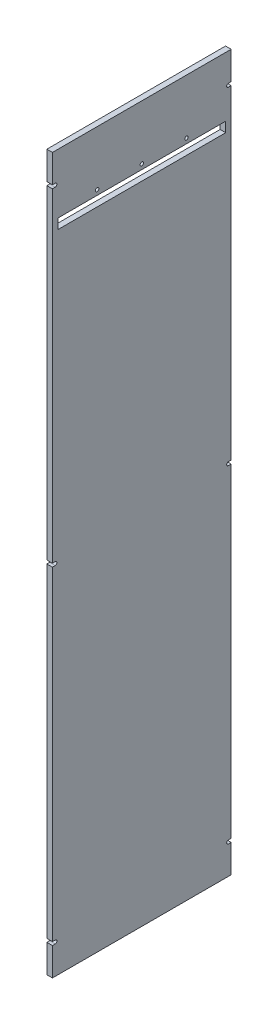
ISO-10303-21;
HEADER;
FILE_DESCRIPTION(('STEP AP214'),'2;1');
FILE_NAME('part.step','',(''),(''),'','','');
FILE_SCHEMA(('AUTOMOTIVE_DESIGN { 1 0 10303 214 1 1 1 1 }'));
ENDSEC;
DATA;
#1=APPLICATION_CONTEXT('core data for automotive mechanical design processes');
#2=APPLICATION_PROTOCOL_DEFINITION('international standard','automotive_design',2000,#1);
#3=PRODUCT_CONTEXT('',#1,'mechanical');
#4=PRODUCT('Part','Part','',(#3));
#5=PRODUCT_RELATED_PRODUCT_CATEGORY('part','',(#4));
#6=PRODUCT_DEFINITION_FORMATION('','',#4);
#7=PRODUCT_DEFINITION_CONTEXT('part definition',#1,'design');
#8=PRODUCT_DEFINITION('design','',#6,#7);
#9=PRODUCT_DEFINITION_SHAPE('','',#8);
#10=(LENGTH_UNIT() NAMED_UNIT(*) SI_UNIT(.MILLI.,.METRE.));
#11=(NAMED_UNIT(*) PLANE_ANGLE_UNIT() SI_UNIT($,.RADIAN.));
#12=(NAMED_UNIT(*) SI_UNIT($,.STERADIAN.) SOLID_ANGLE_UNIT());
#13=UNCERTAINTY_MEASURE_WITH_UNIT(LENGTH_MEASURE(1.E-05),#10,'distance_accuracy_value','');
#14=(GEOMETRIC_REPRESENTATION_CONTEXT(3) GLOBAL_UNCERTAINTY_ASSIGNED_CONTEXT((#13)) GLOBAL_UNIT_ASSIGNED_CONTEXT((#10,
#11,#12)) REPRESENTATION_CONTEXT('',''));
#15=CARTESIAN_POINT('',(0.,0.,0.));
#16=DIRECTION('',(0.,0.,1.));
#17=DIRECTION('',(1.,0.,0.));
#18=AXIS2_PLACEMENT_3D('',#15,#16,#17);
#19=CARTESIAN_POINT('',(0.,609.6,0.));
#20=DIRECTION('',(0.,0.,-1.));
#21=DIRECTION('',(-1.,0.,0.));
#22=AXIS2_PLACEMENT_3D('',#19,#20,#21);
#23=PLANE('',#22);
#24=DIRECTION('',(0.,-1.,0.));
#25=VECTOR('',#24,1.);
#26=CARTESIAN_POINT('',(4.7625,609.6,0.));
#27=LINE('',#26,#25);
#28=CARTESIAN_POINT('',(4.7625,582.7395,0.));
#29=VERTEX_POINT('',#28);
#30=CARTESIAN_POINT('',(4.7625,306.2605,0.));
#31=VERTEX_POINT('',#30);
#32=EDGE_CURVE('E492',#29,#31,#27,.T.);
#33=ORIENTED_EDGE('',*,*,#32,.F.);
#34=DIRECTION('',(1.,0.,0.));
#35=VECTOR('',#34,1.);
#36=CARTESIAN_POINT('',(0.,582.7395,0.));
#37=LINE('',#36,#35);
#38=CARTESIAN_POINT('',(0.,582.7395,0.));
#39=VERTEX_POINT('',#38);
#40=EDGE_CURVE('E302',#39,#29,#37,.T.);
#41=ORIENTED_EDGE('',*,*,#40,.F.);
#42=DIRECTION('',(0.,-1.,0.));
#43=VECTOR('',#42,1.);
#44=CARTESIAN_POINT('',(0.,609.6,0.));
#45=LINE('',#44,#43);
#46=CARTESIAN_POINT('',(0.,306.2605,0.));
#47=VERTEX_POINT('',#46);
#48=EDGE_CURVE('E43',#39,#47,#45,.T.);
#49=ORIENTED_EDGE('',*,*,#48,.T.);
#50=DIRECTION('',(1.,0.,0.));
#51=VECTOR('',#50,1.);
#52=CARTESIAN_POINT('',(0.,306.2605,0.));
#53=LINE('',#52,#51);
#54=EDGE_CURVE('E380',#47,#31,#53,.T.);
#55=ORIENTED_EDGE('',*,*,#54,.T.);
#56=EDGE_LOOP('',(#33,#41,#49,#55));
#57=FACE_BOUND('',#56,.T.);
#58=ADVANCED_FACE('F35',(#57),#23,.F.);
#59=CARTESIAN_POINT('',(4.7625,303.3395,0.));
#60=VERTEX_POINT('',#59);
#61=CARTESIAN_POINT('',(4.7625,26.8605000000001,0.));
#62=VERTEX_POINT('',#61);
#63=EDGE_CURVE('E493',#60,#62,#27,.T.);
#64=ORIENTED_EDGE('',*,*,#63,.F.);
#65=DIRECTION('',(1.,0.,0.));
#66=VECTOR('',#65,1.);
#67=CARTESIAN_POINT('',(0.,303.3395,0.));
#68=LINE('',#67,#66);
#69=CARTESIAN_POINT('',(0.,303.3395,0.));
#70=VERTEX_POINT('',#69);
#71=EDGE_CURVE('E378',#70,#60,#68,.T.);
#72=ORIENTED_EDGE('',*,*,#71,.F.);
#73=CARTESIAN_POINT('',(0.,26.8605000000001,0.));
#74=VERTEX_POINT('',#73);
#75=EDGE_CURVE('E44',#70,#74,#45,.T.);
#76=ORIENTED_EDGE('',*,*,#75,.T.);
#77=DIRECTION('',(1.,0.,0.));
#78=VECTOR('',#77,1.);
#79=CARTESIAN_POINT('',(0.,26.8605000000001,0.));
#80=LINE('',#79,#78);
#81=EDGE_CURVE('E406',#74,#62,#80,.T.);
#82=ORIENTED_EDGE('',*,*,#81,.T.);
#83=EDGE_LOOP('',(#64,#72,#76,#82));
#84=FACE_BOUND('',#83,.T.);
#85=ADVANCED_FACE('F545',(#84),#23,.F.);
#86=CARTESIAN_POINT('',(0.,609.6,-152.4));
#87=DIRECTION('',(0.,0.,1.));
#88=DIRECTION('',(1.,0.,0.));
#89=AXIS2_PLACEMENT_3D('',#86,#87,#88);
#90=PLANE('',#89);
#91=DIRECTION('',(0.,-1.,0.));
#92=VECTOR('',#91,1.);
#93=CARTESIAN_POINT('',(4.7625,609.6,-152.4));
#94=LINE('',#93,#92);
#95=CARTESIAN_POINT('',(4.7625,609.6,-152.4));
#96=VERTEX_POINT('',#95);
#97=CARTESIAN_POINT('',(4.7625,585.6605,-152.4));
#98=VERTEX_POINT('',#97);
#99=EDGE_CURVE('E486',#96,#98,#94,.T.);
#100=ORIENTED_EDGE('',*,*,#99,.T.);
#101=DIRECTION('',(1.,0.,0.));
#102=VECTOR('',#101,1.);
#103=CARTESIAN_POINT('',(0.,585.6605,-152.4));
#104=LINE('',#103,#102);
#105=CARTESIAN_POINT('',(0.,585.6605,-152.4));
#106=VERTEX_POINT('',#105);
#107=EDGE_CURVE('E327',#106,#98,#104,.T.);
#108=ORIENTED_EDGE('',*,*,#107,.F.);
#109=DIRECTION('',(0.,-1.,0.));
#110=VECTOR('',#109,1.);
#111=CARTESIAN_POINT('',(0.,609.6,-152.4));
#112=LINE('',#111,#110);
#113=CARTESIAN_POINT('',(0.,609.6,-152.4));
#114=VERTEX_POINT('',#113);
#115=EDGE_CURVE('E482',#114,#106,#112,.T.);
#116=ORIENTED_EDGE('',*,*,#115,.F.);
#117=DIRECTION('',(-1.,0.,0.));
#118=VECTOR('',#117,1.);
#119=CARTESIAN_POINT('',(0.,609.6,-152.4));
#120=LINE('',#119,#118);
#121=EDGE_CURVE('E469',#96,#114,#120,.T.);
#122=ORIENTED_EDGE('',*,*,#121,.F.);
#123=EDGE_LOOP('',(#100,#108,#116,#122));
#124=FACE_BOUND('',#123,.T.);
#125=ADVANCED_FACE('F551',(#124),#90,.F.);
#126=CARTESIAN_POINT('',(0.,582.7395,-152.4));
#127=VERTEX_POINT('',#126);
#128=CARTESIAN_POINT('',(0.,306.2605,-152.4));
#129=VERTEX_POINT('',#128);
#130=EDGE_CURVE('E485',#127,#129,#112,.T.);
#131=ORIENTED_EDGE('',*,*,#130,.F.);
#132=DIRECTION('',(1.,0.,0.));
#133=VECTOR('',#132,1.);
#134=CARTESIAN_POINT('',(0.,582.7395,-152.4));
#135=LINE('',#134,#133);
#136=CARTESIAN_POINT('',(4.7625,582.7395,-152.4));
#137=VERTEX_POINT('',#136);
#138=EDGE_CURVE('E329',#127,#137,#135,.T.);
#139=ORIENTED_EDGE('',*,*,#138,.T.);
#140=CARTESIAN_POINT('',(4.7625,306.2605,-152.4));
#141=VERTEX_POINT('',#140);
#142=EDGE_CURVE('E489',#137,#141,#94,.T.);
#143=ORIENTED_EDGE('',*,*,#142,.T.);
#144=DIRECTION('',(1.,0.,0.));
#145=VECTOR('',#144,1.);
#146=CARTESIAN_POINT('',(0.,306.2605,-152.4));
#147=LINE('',#146,#145);
#148=EDGE_CURVE('E281',#129,#141,#147,.T.);
#149=ORIENTED_EDGE('',*,*,#148,.F.);
#150=EDGE_LOOP('',(#131,#139,#143,#149));
#151=FACE_BOUND('',#150,.T.);
#152=ADVANCED_FACE('F529',(#151),#90,.F.);
#153=CARTESIAN_POINT('',(0.,303.3395,-152.4));
#154=VERTEX_POINT('',#153);
#155=CARTESIAN_POINT('',(0.,26.8605000000001,-152.4));
#156=VERTEX_POINT('',#155);
#157=EDGE_CURVE('E626',#154,#156,#112,.T.);
#158=ORIENTED_EDGE('',*,*,#157,.F.);
#159=DIRECTION('',(1.,0.,0.));
#160=VECTOR('',#159,1.);
#161=CARTESIAN_POINT('',(0.,303.3395,-152.4));
#162=LINE('',#161,#160);
#163=CARTESIAN_POINT('',(4.7625,303.3395,-152.4));
#164=VERTEX_POINT('',#163);
#165=EDGE_CURVE('E256',#154,#164,#162,.T.);
#166=ORIENTED_EDGE('',*,*,#165,.T.);
#167=CARTESIAN_POINT('',(4.7625,26.8605000000001,-152.4));
#168=VERTEX_POINT('',#167);
#169=EDGE_CURVE('E519',#164,#168,#94,.T.);
#170=ORIENTED_EDGE('',*,*,#169,.T.);
#171=DIRECTION('',(1.,0.,0.));
#172=VECTOR('',#171,1.);
#173=CARTESIAN_POINT('',(0.,26.8605000000001,-152.4));
#174=LINE('',#173,#172);
#175=EDGE_CURVE('E355',#156,#168,#174,.T.);
#176=ORIENTED_EDGE('',*,*,#175,.F.);
#177=EDGE_LOOP('',(#158,#166,#170,#176));
#178=FACE_BOUND('',#177,.T.);
#179=ADVANCED_FACE('F564',(#178),#90,.F.);
#180=CARTESIAN_POINT('',(4.7625,23.9395000000001,0.));
#181=VERTEX_POINT('',#180);
#182=CARTESIAN_POINT('',(4.7625,0.,0.));
#183=VERTEX_POINT('',#182);
#184=EDGE_CURVE('E488',#181,#183,#27,.T.);
#185=ORIENTED_EDGE('',*,*,#184,.F.);
#186=DIRECTION('',(1.,0.,0.));
#187=VECTOR('',#186,1.);
#188=CARTESIAN_POINT('',(0.,23.9395000000001,0.));
#189=LINE('',#188,#187);
#190=CARTESIAN_POINT('',(0.,23.9395000000001,0.));
#191=VERTEX_POINT('',#190);
#192=EDGE_CURVE('E404',#191,#181,#189,.T.);
#193=ORIENTED_EDGE('',*,*,#192,.F.);
#194=CARTESIAN_POINT('',(0.,0.,0.));
#195=VERTEX_POINT('',#194);
#196=EDGE_CURVE('E45',#191,#195,#45,.T.);
#197=ORIENTED_EDGE('',*,*,#196,.T.);
#198=DIRECTION('',(1.,0.,0.));
#199=VECTOR('',#198,1.);
#200=CARTESIAN_POINT('',(0.,0.,0.));
#201=LINE('',#200,#199);
#202=EDGE_CURVE('E474',#195,#183,#201,.T.);
#203=ORIENTED_EDGE('',*,*,#202,.T.);
#204=EDGE_LOOP('',(#185,#193,#197,#203));
#205=FACE_BOUND('',#204,.T.);
#206=ADVANCED_FACE('F510',(#205),#23,.F.);
#207=CARTESIAN_POINT('',(0.,609.6,0.));
#208=DIRECTION('',(1.,0.,0.));
#209=DIRECTION('',(0.,0.,-1.));
#210=AXIS2_PLACEMENT_3D('',#207,#208,#209);
#211=PLANE('',#210);
#212=CARTESIAN_POINT('',(0.,563.0545,-76.2));
#213=DIRECTION('',(1.,0.,0.));
#214=DIRECTION('',(0.,0.,-1.));
#215=AXIS2_PLACEMENT_3D('',#212,#213,#214);
#216=CIRCLE('',#215,1.47319999999995);
#217=CARTESIAN_POINT('',(0.,563.0545,-77.6732));
#218=VERTEX_POINT('',#217);
#219=EDGE_CURVE('E413',#218,#218,#216,.T.);
#220=ORIENTED_EDGE('',*,*,#219,.T.);
#221=EDGE_LOOP('',(#220));
#222=FACE_BOUND('',#221,.T.);
#223=CARTESIAN_POINT('',(0.,563.0545,-38.1));
#224=DIRECTION('',(1.,0.,0.));
#225=DIRECTION('',(0.,0.,-1.));
#226=AXIS2_PLACEMENT_3D('',#223,#224,#225);
#227=CIRCLE('',#226,1.47319999999995);
#228=CARTESIAN_POINT('',(0.,563.0545,-39.5732));
#229=VERTEX_POINT('',#228);
#230=EDGE_CURVE('E419',#229,#229,#227,.T.);
#231=ORIENTED_EDGE('',*,*,#230,.T.);
#232=EDGE_LOOP('',(#231));
#233=FACE_BOUND('',#232,.T.);
#234=CARTESIAN_POINT('',(0.,563.0545,-114.3));
#235=DIRECTION('',(1.,0.,0.));
#236=DIRECTION('',(0.,0.,-1.));
#237=AXIS2_PLACEMENT_3D('',#234,#235,#236);
#238=CIRCLE('',#237,1.47319999999995);
#239=CARTESIAN_POINT('',(0.,563.0545,-115.7732));
#240=VERTEX_POINT('',#239);
#241=EDGE_CURVE('E425',#240,#240,#238,.T.);
#242=ORIENTED_EDGE('',*,*,#241,.T.);
#243=EDGE_LOOP('',(#242));
#244=FACE_BOUND('',#243,.T.);
#245=DIRECTION('',(0.,0.,-1.));
#246=VECTOR('',#245,1.);
#247=CARTESIAN_POINT('',(0.,550.291,-147.7645));
#248=LINE('',#247,#246);
#249=CARTESIAN_POINT('',(0.,550.291,-4.63550000000007));
#250=VERTEX_POINT('',#249);
#251=CARTESIAN_POINT('',(0.,550.291,-147.7645));
#252=VERTEX_POINT('',#251);
#253=EDGE_CURVE('E439',#250,#252,#248,.T.);
#254=ORIENTED_EDGE('',*,*,#253,.T.);
#255=DIRECTION('',(0.,1.,0.));
#256=VECTOR('',#255,1.);
#257=CARTESIAN_POINT('',(0.,550.291,-147.7645));
#258=LINE('',#257,#256);
#259=CARTESIAN_POINT('',(0.,558.8,-147.7645));
#260=VERTEX_POINT('',#259);
#261=EDGE_CURVE('E429',#252,#260,#258,.T.);
#262=ORIENTED_EDGE('',*,*,#261,.T.);
#263=DIRECTION('',(0.,0.,1.));
#264=VECTOR('',#263,1.);
#265=CARTESIAN_POINT('',(0.,558.8,-147.7645));
#266=LINE('',#265,#264);
#267=CARTESIAN_POINT('',(0.,558.8,-4.63550000000007));
#268=VERTEX_POINT('',#267);
#269=EDGE_CURVE('E432',#260,#268,#266,.T.);
#270=ORIENTED_EDGE('',*,*,#269,.T.);
#271=DIRECTION('',(0.,-1.,0.));
#272=VECTOR('',#271,1.);
#273=CARTESIAN_POINT('',(0.,550.291,-4.63550000000007));
#274=LINE('',#273,#272);
#275=EDGE_CURVE('E436',#268,#250,#274,.T.);
#276=ORIENTED_EDGE('',*,*,#275,.T.);
#277=EDGE_LOOP('',(#254,#262,#270,#276));
#278=FACE_BOUND('',#277,.T.);
#279=ORIENTED_EDGE('',*,*,#115,.T.);
#280=DIRECTION('',(0.,0.,1.));
#281=VECTOR('',#280,1.);
#282=CARTESIAN_POINT('',(0.,585.6605,-150.01875));
#283=LINE('',#282,#281);
#284=CARTESIAN_POINT('',(0.,585.6605,-150.01875));
#285=VERTEX_POINT('',#284);
#286=EDGE_CURVE('E315',#106,#285,#283,.T.);
#287=ORIENTED_EDGE('',*,*,#286,.T.);
#288=CARTESIAN_POINT('',(0.,584.2,-150.01875));
#289=DIRECTION('',(1.,0.,0.));
#290=DIRECTION('',(0.,0.,-1.));
#291=AXIS2_PLACEMENT_3D('',#288,#289,#290);
#292=CIRCLE('',#291,1.46049999999998);
#293=CARTESIAN_POINT('',(0.,582.7395,-150.01875));
#294=VERTEX_POINT('',#293);
#295=EDGE_CURVE('E308',#285,#294,#292,.T.);
#296=ORIENTED_EDGE('',*,*,#295,.T.);
#297=DIRECTION('',(0.,0.,-1.));
#298=VECTOR('',#297,1.);
#299=CARTESIAN_POINT('',(0.,582.7395,-150.01875));
#300=LINE('',#299,#298);
#301=EDGE_CURVE('E311',#294,#127,#300,.T.);
#302=ORIENTED_EDGE('',*,*,#301,.T.);
#303=ORIENTED_EDGE('',*,*,#130,.T.);
#304=DIRECTION('',(0.,0.,1.));
#305=VECTOR('',#304,1.);
#306=CARTESIAN_POINT('',(0.,306.2605,-150.01875));
#307=LINE('',#306,#305);
#308=CARTESIAN_POINT('',(0.,306.2605,-150.01875));
#309=VERTEX_POINT('',#308);
#310=EDGE_CURVE('E257',#129,#309,#307,.T.);
#311=ORIENTED_EDGE('',*,*,#310,.T.);
#312=CARTESIAN_POINT('',(0.,304.8,-150.01875));
#313=DIRECTION('',(1.,0.,0.));
#314=DIRECTION('',(0.,0.,-1.));
#315=AXIS2_PLACEMENT_3D('',#312,#313,#314);
#316=CIRCLE('',#315,1.4605);
#317=CARTESIAN_POINT('',(0.,303.3395,-150.01875));
#318=VERTEX_POINT('',#317);
#319=EDGE_CURVE('E250',#309,#318,#316,.T.);
#320=ORIENTED_EDGE('',*,*,#319,.T.);
#321=DIRECTION('',(0.,0.,-1.));
#322=VECTOR('',#321,1.);
#323=CARTESIAN_POINT('',(0.,303.3395,-150.01875));
#324=LINE('',#323,#322);
#325=EDGE_CURVE('E260',#318,#154,#324,.T.);
#326=ORIENTED_EDGE('',*,*,#325,.T.);
#327=ORIENTED_EDGE('',*,*,#157,.T.);
#328=DIRECTION('',(0.,0.,1.));
#329=VECTOR('',#328,1.);
#330=CARTESIAN_POINT('',(0.,26.8605,-150.01875));
#331=LINE('',#330,#329);
#332=CARTESIAN_POINT('',(0.,26.8605,-150.01875));
#333=VERTEX_POINT('',#332);
#334=EDGE_CURVE('E340',#156,#333,#331,.T.);
#335=ORIENTED_EDGE('',*,*,#334,.T.);
#336=CARTESIAN_POINT('',(0.,25.4,-150.01875));
#337=DIRECTION('',(1.,0.,0.));
#338=DIRECTION('',(0.,0.,-1.));
#339=AXIS2_PLACEMENT_3D('',#336,#337,#338);
#340=CIRCLE('',#339,1.4605);
#341=CARTESIAN_POINT('',(0.,23.9395,-150.01875));
#342=VERTEX_POINT('',#341);
#343=EDGE_CURVE('E333',#333,#342,#340,.T.);
#344=ORIENTED_EDGE('',*,*,#343,.T.);
#345=DIRECTION('',(0.,0.,-1.));
#346=VECTOR('',#345,1.);
#347=CARTESIAN_POINT('',(0.,23.9395,-150.01875));
#348=LINE('',#347,#346);
#349=CARTESIAN_POINT('',(0.,23.9395000000001,-152.4));
#350=VERTEX_POINT('',#349);
#351=EDGE_CURVE('E336',#342,#350,#348,.T.);
#352=ORIENTED_EDGE('',*,*,#351,.T.);
#353=CARTESIAN_POINT('',(0.,0.,-152.4));
#354=VERTEX_POINT('',#353);
#355=EDGE_CURVE('E471',#350,#354,#112,.T.);
#356=ORIENTED_EDGE('',*,*,#355,.T.);
#357=DIRECTION('',(0.,0.,1.));
#358=VECTOR('',#357,1.);
#359=CARTESIAN_POINT('',(0.,0.,0.));
#360=LINE('',#359,#358);
#361=EDGE_CURVE('E454',#354,#195,#360,.T.);
#362=ORIENTED_EDGE('',*,*,#361,.T.);
#363=ORIENTED_EDGE('',*,*,#196,.F.);
#364=DIRECTION('',(0.,0.,-1.));
#365=VECTOR('',#364,1.);
#366=CARTESIAN_POINT('',(0.,23.9395,-2.38124999999999));
#367=LINE('',#366,#365);
#368=CARTESIAN_POINT('',(0.,23.9395,-2.38124999999999));
#369=VERTEX_POINT('',#368);
#370=EDGE_CURVE('E391',#191,#369,#367,.T.);
#371=ORIENTED_EDGE('',*,*,#370,.T.);
#372=CARTESIAN_POINT('',(0.,25.4,-2.38124999999999));
#373=DIRECTION('',(1.,0.,0.));
#374=DIRECTION('',(0.,0.,-1.));
#375=AXIS2_PLACEMENT_3D('',#372,#373,#374);
#376=CIRCLE('',#375,1.4605);
#377=CARTESIAN_POINT('',(0.,26.8605,-2.38124999999999));
#378=VERTEX_POINT('',#377);
#379=EDGE_CURVE('E384',#369,#378,#376,.T.);
#380=ORIENTED_EDGE('',*,*,#379,.T.);
#381=DIRECTION('',(0.,0.,1.));
#382=VECTOR('',#381,1.);
#383=CARTESIAN_POINT('',(0.,26.8605,-2.38124999999999));
#384=LINE('',#383,#382);
#385=EDGE_CURVE('E387',#378,#74,#384,.T.);
#386=ORIENTED_EDGE('',*,*,#385,.T.);
#387=ORIENTED_EDGE('',*,*,#75,.F.);
#388=DIRECTION('',(0.,0.,-1.));
#389=VECTOR('',#388,1.);
#390=CARTESIAN_POINT('',(0.,303.3395,-2.38124999999999));
#391=LINE('',#390,#389);
#392=CARTESIAN_POINT('',(0.,303.3395,-2.38124999999999));
#393=VERTEX_POINT('',#392);
#394=EDGE_CURVE('E368',#70,#393,#391,.T.);
#395=ORIENTED_EDGE('',*,*,#394,.T.);
#396=CARTESIAN_POINT('',(0.,304.8,-2.38124999999999));
#397=DIRECTION('',(1.,0.,0.));
#398=DIRECTION('',(0.,0.,-1.));
#399=AXIS2_PLACEMENT_3D('',#396,#397,#398);
#400=CIRCLE('',#399,1.4605);
#401=CARTESIAN_POINT('',(0.,306.2605,-2.38124999999999));
#402=VERTEX_POINT('',#401);
#403=EDGE_CURVE('E361',#393,#402,#400,.T.);
#404=ORIENTED_EDGE('',*,*,#403,.T.);
#405=DIRECTION('',(0.,0.,1.));
#406=VECTOR('',#405,1.);
#407=CARTESIAN_POINT('',(0.,306.2605,-2.38124999999999));
#408=LINE('',#407,#406);
#409=EDGE_CURVE('E364',#402,#47,#408,.T.);
#410=ORIENTED_EDGE('',*,*,#409,.T.);
#411=ORIENTED_EDGE('',*,*,#48,.F.);
#412=DIRECTION('',(0.,0.,-1.));
#413=VECTOR('',#412,1.);
#414=CARTESIAN_POINT('',(0.,582.7395,-2.38124999999999));
#415=LINE('',#414,#413);
#416=CARTESIAN_POINT('',(0.,582.7395,-2.38124999999999));
#417=VERTEX_POINT('',#416);
#418=EDGE_CURVE('E291',#39,#417,#415,.T.);
#419=ORIENTED_EDGE('',*,*,#418,.T.);
#420=CARTESIAN_POINT('',(0.,584.2,-2.38124999999999));
#421=DIRECTION('',(1.,0.,0.));
#422=DIRECTION('',(0.,0.,-1.));
#423=AXIS2_PLACEMENT_3D('',#420,#421,#422);
#424=CIRCLE('',#423,1.46049999999998);
#425=CARTESIAN_POINT('',(0.,585.6605,-2.38124999999999));
#426=VERTEX_POINT('',#425);
#427=EDGE_CURVE('E284',#417,#426,#424,.T.);
#428=ORIENTED_EDGE('',*,*,#427,.T.);
#429=DIRECTION('',(0.,0.,1.));
#430=VECTOR('',#429,1.);
#431=CARTESIAN_POINT('',(0.,585.6605,-2.38124999999999));
#432=LINE('',#431,#430);
#433=CARTESIAN_POINT('',(0.,585.6605,0.));
#434=VERTEX_POINT('',#433);
#435=EDGE_CURVE('E287',#426,#434,#432,.T.);
#436=ORIENTED_EDGE('',*,*,#435,.T.);
#437=CARTESIAN_POINT('',(0.,609.6,0.));
#438=VERTEX_POINT('',#437);
#439=EDGE_CURVE('E11',#438,#434,#45,.T.);
#440=ORIENTED_EDGE('',*,*,#439,.F.);
#441=DIRECTION('',(0.,0.,1.));
#442=VECTOR('',#441,1.);
#443=CARTESIAN_POINT('',(0.,609.6,0.));
#444=LINE('',#443,#442);
#445=EDGE_CURVE('E461',#114,#438,#444,.T.);
#446=ORIENTED_EDGE('',*,*,#445,.F.);
#447=EDGE_LOOP('',(#279,#287,#296,#302,#303,#311,#320,#326,#327,#335,#344,#352,#356,#362,#363,
#371,#380,#386,#387,#395,#404,#410,#411,#419,#428,#436,#440,#446));
#448=FACE_BOUND('',#447,.T.);
#449=ADVANCED_FACE('F37',(#222,#233,#244,#278,#448),#211,.F.);
#450=ORIENTED_EDGE('',*,*,#439,.T.);
#451=DIRECTION('',(1.,0.,0.));
#452=VECTOR('',#451,1.);
#453=CARTESIAN_POINT('',(0.,585.6605,0.));
#454=LINE('',#453,#452);
#455=CARTESIAN_POINT('',(4.7625,585.6605,0.));
#456=VERTEX_POINT('',#455);
#457=EDGE_CURVE('E304',#434,#456,#454,.T.);
#458=ORIENTED_EDGE('',*,*,#457,.T.);
#459=CARTESIAN_POINT('',(4.7625,609.6,0.));
#460=VERTEX_POINT('',#459);
#461=EDGE_CURVE('E490',#460,#456,#27,.T.);
#462=ORIENTED_EDGE('',*,*,#461,.F.);
#463=DIRECTION('',(1.,0.,0.));
#464=VECTOR('',#463,1.);
#465=CARTESIAN_POINT('',(0.,609.6,0.));
#466=LINE('',#465,#464);
#467=EDGE_CURVE('E464',#438,#460,#466,.T.);
#468=ORIENTED_EDGE('',*,*,#467,.F.);
#469=EDGE_LOOP('',(#450,#458,#462,#468));
#470=FACE_BOUND('',#469,.T.);
#471=ADVANCED_FACE('F547',(#470),#23,.F.);
#472=CARTESIAN_POINT('',(4.7625,609.6,0.));
#473=DIRECTION('',(-1.,0.,0.));
#474=DIRECTION('',(0.,0.,1.));
#475=AXIS2_PLACEMENT_3D('',#472,#473,#474);
#476=PLANE('',#475);
#477=CARTESIAN_POINT('',(4.7625,563.0545,-76.2));
#478=DIRECTION('',(1.,0.,0.));
#479=DIRECTION('',(0.,0.,-1.));
#480=AXIS2_PLACEMENT_3D('',#477,#478,#479);
#481=CIRCLE('',#480,1.47319999999995);
#482=CARTESIAN_POINT('',(4.7625,563.0545,-77.6732));
#483=VERTEX_POINT('',#482);
#484=EDGE_CURVE('E403',#483,#483,#481,.T.);
#485=ORIENTED_EDGE('',*,*,#484,.F.);
#486=EDGE_LOOP('',(#485));
#487=FACE_BOUND('',#486,.T.);
#488=CARTESIAN_POINT('',(4.7625,563.0545,-38.1));
#489=DIRECTION('',(1.,0.,0.));
#490=DIRECTION('',(0.,0.,-1.));
#491=AXIS2_PLACEMENT_3D('',#488,#489,#490);
#492=CIRCLE('',#491,1.47319999999995);
#493=CARTESIAN_POINT('',(4.7625,563.0545,-39.5732));
#494=VERTEX_POINT('',#493);
#495=EDGE_CURVE('E416',#494,#494,#492,.T.);
#496=ORIENTED_EDGE('',*,*,#495,.F.);
#497=EDGE_LOOP('',(#496));
#498=FACE_BOUND('',#497,.T.);
#499=CARTESIAN_POINT('',(4.7625,563.0545,-114.3));
#500=DIRECTION('',(1.,0.,0.));
#501=DIRECTION('',(0.,0.,-1.));
#502=AXIS2_PLACEMENT_3D('',#499,#500,#501);
#503=CIRCLE('',#502,1.47319999999995);
#504=CARTESIAN_POINT('',(4.7625,563.0545,-115.7732));
#505=VERTEX_POINT('',#504);
#506=EDGE_CURVE('E422',#505,#505,#503,.T.);
#507=ORIENTED_EDGE('',*,*,#506,.F.);
#508=EDGE_LOOP('',(#507));
#509=FACE_BOUND('',#508,.T.);
#510=DIRECTION('',(0.,0.,1.));
#511=VECTOR('',#510,1.);
#512=CARTESIAN_POINT('',(4.7625,558.8,-147.7645));
#513=LINE('',#512,#511);
#514=CARTESIAN_POINT('',(4.7625,558.8,-147.7645));
#515=VERTEX_POINT('',#514);
#516=CARTESIAN_POINT('',(4.7625,558.8,-4.63550000000007));
#517=VERTEX_POINT('',#516);
#518=EDGE_CURVE('E444',#515,#517,#513,.T.);
#519=ORIENTED_EDGE('',*,*,#518,.F.);
#520=DIRECTION('',(0.,1.,0.));
#521=VECTOR('',#520,1.);
#522=CARTESIAN_POINT('',(4.7625,550.291,-147.7645));
#523=LINE('',#522,#521);
#524=CARTESIAN_POINT('',(4.7625,550.291,-147.7645));
#525=VERTEX_POINT('',#524);
#526=EDGE_CURVE('E428',#525,#515,#523,.T.);
#527=ORIENTED_EDGE('',*,*,#526,.F.);
#528=DIRECTION('',(0.,0.,-1.));
#529=VECTOR('',#528,1.);
#530=CARTESIAN_POINT('',(4.7625,550.291,-147.7645));
#531=LINE('',#530,#529);
#532=CARTESIAN_POINT('',(4.7625,550.291,-4.63550000000007));
#533=VERTEX_POINT('',#532);
#534=EDGE_CURVE('E433',#533,#525,#531,.T.);
#535=ORIENTED_EDGE('',*,*,#534,.F.);
#536=DIRECTION('',(0.,-1.,0.));
#537=VECTOR('',#536,1.);
#538=CARTESIAN_POINT('',(4.7625,550.291,-4.63550000000007));
#539=LINE('',#538,#537);
#540=EDGE_CURVE('E447',#517,#533,#539,.T.);
#541=ORIENTED_EDGE('',*,*,#540,.F.);
#542=EDGE_LOOP('',(#519,#527,#535,#541));
#543=FACE_BOUND('',#542,.T.);
#544=CARTESIAN_POINT('',(4.7625,584.2,-150.01875));
#545=DIRECTION('',(1.,0.,0.));
#546=DIRECTION('',(0.,0.,-1.));
#547=AXIS2_PLACEMENT_3D('',#544,#545,#546);
#548=CIRCLE('',#547,1.46049999999998);
#549=CARTESIAN_POINT('',(4.7625,585.6605,-150.01875));
#550=VERTEX_POINT('',#549);
#551=CARTESIAN_POINT('',(4.7625,582.7395,-150.01875));
#552=VERTEX_POINT('',#551);
#553=EDGE_CURVE('E319',#550,#552,#548,.T.);
#554=ORIENTED_EDGE('',*,*,#553,.F.);
#555=DIRECTION('',(0.,0.,1.));
#556=VECTOR('',#555,1.);
#557=CARTESIAN_POINT('',(4.7625,585.6605,-150.01875));
#558=LINE('',#557,#556);
#559=EDGE_CURVE('E312',#98,#550,#558,.T.);
#560=ORIENTED_EDGE('',*,*,#559,.F.);
#561=ORIENTED_EDGE('',*,*,#99,.F.);
#562=DIRECTION('',(0.,0.,-1.));
#563=VECTOR('',#562,1.);
#564=CARTESIAN_POINT('',(4.7625,609.6,0.));
#565=LINE('',#564,#563);
#566=EDGE_CURVE('E467',#460,#96,#565,.T.);
#567=ORIENTED_EDGE('',*,*,#566,.F.);
#568=ORIENTED_EDGE('',*,*,#461,.T.);
#569=DIRECTION('',(0.,0.,1.));
#570=VECTOR('',#569,1.);
#571=CARTESIAN_POINT('',(4.7625,585.6605,-2.38124999999999));
#572=LINE('',#571,#570);
#573=CARTESIAN_POINT('',(4.7625,585.6605,-2.38124999999999));
#574=VERTEX_POINT('',#573);
#575=EDGE_CURVE('E296',#574,#456,#572,.T.);
#576=ORIENTED_EDGE('',*,*,#575,.F.);
#577=CARTESIAN_POINT('',(4.7625,584.2,-2.38124999999999));
#578=DIRECTION('',(1.,0.,0.));
#579=DIRECTION('',(0.,0.,-1.));
#580=AXIS2_PLACEMENT_3D('',#577,#578,#579);
#581=CIRCLE('',#580,1.46049999999998);
#582=CARTESIAN_POINT('',(4.7625,582.7395,-2.38124999999999));
#583=VERTEX_POINT('',#582);
#584=EDGE_CURVE('E52',#583,#574,#581,.T.);
#585=ORIENTED_EDGE('',*,*,#584,.F.);
#586=DIRECTION('',(0.,0.,-1.));
#587=VECTOR('',#586,1.);
#588=CARTESIAN_POINT('',(4.7625,582.7395,-2.38124999999999));
#589=LINE('',#588,#587);
#590=EDGE_CURVE('E288',#29,#583,#589,.T.);
#591=ORIENTED_EDGE('',*,*,#590,.F.);
#592=ORIENTED_EDGE('',*,*,#32,.T.);
#593=DIRECTION('',(0.,0.,1.));
#594=VECTOR('',#593,1.);
#595=CARTESIAN_POINT('',(4.7625,306.2605,-2.38124999999999));
#596=LINE('',#595,#594);
#597=CARTESIAN_POINT('',(4.7625,306.2605,-2.38124999999999));
#598=VERTEX_POINT('',#597);
#599=EDGE_CURVE('E373',#598,#31,#596,.T.);
#600=ORIENTED_EDGE('',*,*,#599,.F.);
#601=CARTESIAN_POINT('',(4.7625,304.8,-2.38124999999999));
#602=DIRECTION('',(1.,0.,0.));
#603=DIRECTION('',(0.,0.,-1.));
#604=AXIS2_PLACEMENT_3D('',#601,#602,#603);
#605=CIRCLE('',#604,1.4605);
#606=CARTESIAN_POINT('',(4.7625,303.3395,-2.38124999999999));
#607=VERTEX_POINT('',#606);
#608=EDGE_CURVE('E60',#607,#598,#605,.T.);
#609=ORIENTED_EDGE('',*,*,#608,.F.);
#610=DIRECTION('',(0.,0.,-1.));
#611=VECTOR('',#610,1.);
#612=CARTESIAN_POINT('',(4.7625,303.3395,-2.38124999999999));
#613=LINE('',#612,#611);
#614=EDGE_CURVE('E365',#60,#607,#613,.T.);
#615=ORIENTED_EDGE('',*,*,#614,.F.);
#616=ORIENTED_EDGE('',*,*,#63,.T.);
#617=DIRECTION('',(0.,0.,1.));
#618=VECTOR('',#617,1.);
#619=CARTESIAN_POINT('',(4.7625,26.8605,-2.38124999999999));
#620=LINE('',#619,#618);
#621=CARTESIAN_POINT('',(4.7625,26.8605,-2.38124999999999));
#622=VERTEX_POINT('',#621);
#623=EDGE_CURVE('E396',#622,#62,#620,.T.);
#624=ORIENTED_EDGE('',*,*,#623,.F.);
#625=CARTESIAN_POINT('',(4.7625,25.4,-2.38124999999999));
#626=DIRECTION('',(1.,0.,0.));
#627=DIRECTION('',(0.,0.,-1.));
#628=AXIS2_PLACEMENT_3D('',#625,#626,#627);
#629=CIRCLE('',#628,1.4605);
#630=CARTESIAN_POINT('',(4.7625,23.9395,-2.38124999999999));
#631=VERTEX_POINT('',#630);
#632=EDGE_CURVE('E354',#631,#622,#629,.T.);
#633=ORIENTED_EDGE('',*,*,#632,.F.);
#634=DIRECTION('',(0.,0.,-1.));
#635=VECTOR('',#634,1.);
#636=CARTESIAN_POINT('',(4.7625,23.9395,-2.38124999999999));
#637=LINE('',#636,#635);
#638=EDGE_CURVE('E388',#181,#631,#637,.T.);
#639=ORIENTED_EDGE('',*,*,#638,.F.);
#640=ORIENTED_EDGE('',*,*,#184,.T.);
#641=DIRECTION('',(0.,0.,-1.));
#642=VECTOR('',#641,1.);
#643=CARTESIAN_POINT('',(4.7625,0.,0.));
#644=LINE('',#643,#642);
#645=CARTESIAN_POINT('',(4.7625,0.,-152.4));
#646=VERTEX_POINT('',#645);
#647=EDGE_CURVE('E477',#183,#646,#644,.T.);
#648=ORIENTED_EDGE('',*,*,#647,.T.);
#649=CARTESIAN_POINT('',(4.7625,23.9395000000002,-152.4));
#650=VERTEX_POINT('',#649);
#651=EDGE_CURVE('E484',#650,#646,#94,.T.);
#652=ORIENTED_EDGE('',*,*,#651,.F.);
#653=DIRECTION('',(0.,0.,-1.));
#654=VECTOR('',#653,1.);
#655=CARTESIAN_POINT('',(4.7625,23.9395,-150.01875));
#656=LINE('',#655,#654);
#657=CARTESIAN_POINT('',(4.7625,23.9395,-150.01875));
#658=VERTEX_POINT('',#657);
#659=EDGE_CURVE('E347',#658,#650,#656,.T.);
#660=ORIENTED_EDGE('',*,*,#659,.F.);
#661=CARTESIAN_POINT('',(4.7625,25.4,-150.01875));
#662=DIRECTION('',(1.,0.,0.));
#663=DIRECTION('',(0.,0.,-1.));
#664=AXIS2_PLACEMENT_3D('',#661,#662,#663);
#665=CIRCLE('',#664,1.4605);
#666=CARTESIAN_POINT('',(4.7625,26.8605,-150.01875));
#667=VERTEX_POINT('',#666);
#668=EDGE_CURVE('E344',#667,#658,#665,.T.);
#669=ORIENTED_EDGE('',*,*,#668,.F.);
#670=DIRECTION('',(0.,0.,1.));
#671=VECTOR('',#670,1.);
#672=CARTESIAN_POINT('',(4.7625,26.8605,-150.01875));
#673=LINE('',#672,#671);
#674=EDGE_CURVE('E337',#168,#667,#673,.T.);
#675=ORIENTED_EDGE('',*,*,#674,.F.);
#676=ORIENTED_EDGE('',*,*,#169,.F.);
#677=DIRECTION('',(0.,0.,-1.));
#678=VECTOR('',#677,1.);
#679=CARTESIAN_POINT('',(4.7625,303.3395,-150.01875));
#680=LINE('',#679,#678);
#681=CARTESIAN_POINT('',(4.7625,303.3395,-150.01875));
#682=VERTEX_POINT('',#681);
#683=EDGE_CURVE('E272',#682,#164,#680,.T.);
#684=ORIENTED_EDGE('',*,*,#683,.F.);
#685=CARTESIAN_POINT('',(4.7625,304.8,-150.01875));
#686=DIRECTION('',(1.,0.,0.));
#687=DIRECTION('',(0.,0.,-1.));
#688=AXIS2_PLACEMENT_3D('',#685,#686,#687);
#689=CIRCLE('',#688,1.4605);
#690=CARTESIAN_POINT('',(4.7625,306.2605,-150.01875));
#691=VERTEX_POINT('',#690);
#692=EDGE_CURVE('E253',#691,#682,#689,.T.);
#693=ORIENTED_EDGE('',*,*,#692,.F.);
#694=DIRECTION('',(0.,0.,1.));
#695=VECTOR('',#694,1.);
#696=CARTESIAN_POINT('',(4.7625,306.2605,-150.01875));
#697=LINE('',#696,#695);
#698=EDGE_CURVE('E269',#141,#691,#697,.T.);
#699=ORIENTED_EDGE('',*,*,#698,.F.);
#700=ORIENTED_EDGE('',*,*,#142,.F.);
#701=DIRECTION('',(0.,0.,-1.));
#702=VECTOR('',#701,1.);
#703=CARTESIAN_POINT('',(4.7625,582.7395,-150.01875));
#704=LINE('',#703,#702);
#705=EDGE_CURVE('E322',#552,#137,#704,.T.);
#706=ORIENTED_EDGE('',*,*,#705,.F.);
#707=EDGE_LOOP('',(#554,#560,#561,#567,#568,#576,#585,#591,#592,#600,#609,#615,#616,#624,#633,
#639,#640,#648,#652,#660,#669,#675,#676,#684,#693,#699,#700,#706));
#708=FACE_BOUND('',#707,.T.);
#709=ADVANCED_FACE('F502',(#487,#498,#509,#543,#708),#476,.F.);
#710=ORIENTED_EDGE('',*,*,#355,.F.);
#711=DIRECTION('',(1.,0.,0.));
#712=VECTOR('',#711,1.);
#713=CARTESIAN_POINT('',(0.,23.9395000000001,-152.4));
#714=LINE('',#713,#712);
#715=EDGE_CURVE('E357',#350,#650,#714,.T.);
#716=ORIENTED_EDGE('',*,*,#715,.T.);
#717=ORIENTED_EDGE('',*,*,#651,.T.);
#718=DIRECTION('',(-1.,0.,0.));
#719=VECTOR('',#718,1.);
#720=CARTESIAN_POINT('',(0.,0.,-152.4));
#721=LINE('',#720,#719);
#722=EDGE_CURVE('E465',#646,#354,#721,.T.);
#723=ORIENTED_EDGE('',*,*,#722,.T.);
#724=EDGE_LOOP('',(#710,#716,#717,#723));
#725=FACE_BOUND('',#724,.T.);
#726=ADVANCED_FACE('F517',(#725),#90,.F.);
#727=CARTESIAN_POINT('',(0.,609.6,0.));
#728=DIRECTION('',(0.,-1.,0.));
#729=DIRECTION('',(0.,0.,-1.));
#730=AXIS2_PLACEMENT_3D('',#727,#728,#729);
#731=PLANE('',#730);
#732=ORIENTED_EDGE('',*,*,#445,.T.);
#733=ORIENTED_EDGE('',*,*,#467,.T.);
#734=ORIENTED_EDGE('',*,*,#566,.T.);
#735=ORIENTED_EDGE('',*,*,#121,.T.);
#736=EDGE_LOOP('',(#732,#733,#734,#735));
#737=FACE_BOUND('',#736,.T.);
#738=ADVANCED_FACE('F574',(#737),#731,.F.);
#739=CARTESIAN_POINT('',(0.,0.,0.));
#740=DIRECTION('',(0.,-1.,0.));
#741=DIRECTION('',(0.,0.,-1.));
#742=AXIS2_PLACEMENT_3D('',#739,#740,#741);
#743=PLANE('',#742);
#744=ORIENTED_EDGE('',*,*,#361,.F.);
#745=ORIENTED_EDGE('',*,*,#722,.F.);
#746=ORIENTED_EDGE('',*,*,#647,.F.);
#747=ORIENTED_EDGE('',*,*,#202,.F.);
#748=EDGE_LOOP('',(#744,#745,#746,#747));
#749=FACE_BOUND('',#748,.T.);
#750=ADVANCED_FACE('F514',(#749),#743,.T.);
#751=CARTESIAN_POINT('',(0.,550.291,-147.7645));
#752=DIRECTION('',(0.,0.,-1.));
#753=DIRECTION('',(0.,1.,0.));
#754=AXIS2_PLACEMENT_3D('',#751,#752,#753);
#755=PLANE('',#754);
#756=ORIENTED_EDGE('',*,*,#526,.T.);
#757=DIRECTION('',(1.,0.,0.));
#758=VECTOR('',#757,1.);
#759=CARTESIAN_POINT('',(0.,558.8,-147.7645));
#760=LINE('',#759,#758);
#761=EDGE_CURVE('E442',#260,#515,#760,.T.);
#762=ORIENTED_EDGE('',*,*,#761,.F.);
#763=ORIENTED_EDGE('',*,*,#261,.F.);
#764=DIRECTION('',(1.,0.,0.));
#765=VECTOR('',#764,1.);
#766=CARTESIAN_POINT('',(0.,550.291,-147.7645));
#767=LINE('',#766,#765);
#768=EDGE_CURVE('E452',#252,#525,#767,.T.);
#769=ORIENTED_EDGE('',*,*,#768,.T.);
#770=EDGE_LOOP('',(#756,#762,#763,#769));
#771=FACE_BOUND('',#770,.T.);
#772=ADVANCED_FACE('F680',(#771),#755,.F.);
#773=CARTESIAN_POINT('',(0.,550.291,-147.7645));
#774=DIRECTION('',(0.,-1.,0.));
#775=DIRECTION('',(0.,0.,-1.));
#776=AXIS2_PLACEMENT_3D('',#773,#774,#775);
#777=PLANE('',#776);
#778=ORIENTED_EDGE('',*,*,#534,.T.);
#779=ORIENTED_EDGE('',*,*,#768,.F.);
#780=ORIENTED_EDGE('',*,*,#253,.F.);
#781=DIRECTION('',(1.,0.,0.));
#782=VECTOR('',#781,1.);
#783=CARTESIAN_POINT('',(0.,550.291,-4.63550000000007));
#784=LINE('',#783,#782);
#785=EDGE_CURVE('E455',#250,#533,#784,.T.);
#786=ORIENTED_EDGE('',*,*,#785,.T.);
#787=EDGE_LOOP('',(#778,#779,#780,#786));
#788=FACE_BOUND('',#787,.T.);
#789=ADVANCED_FACE('F676',(#788),#777,.F.);
#790=CARTESIAN_POINT('',(0.,550.291,-4.63550000000007));
#791=DIRECTION('',(0.,0.,1.));
#792=DIRECTION('',(1.,0.,0.));
#793=AXIS2_PLACEMENT_3D('',#790,#791,#792);
#794=PLANE('',#793);
#795=ORIENTED_EDGE('',*,*,#540,.T.);
#796=ORIENTED_EDGE('',*,*,#785,.F.);
#797=ORIENTED_EDGE('',*,*,#275,.F.);
#798=DIRECTION('',(1.,0.,0.));
#799=VECTOR('',#798,1.);
#800=CARTESIAN_POINT('',(0.,558.8,-4.63550000000007));
#801=LINE('',#800,#799);
#802=EDGE_CURVE('E457',#268,#517,#801,.T.);
#803=ORIENTED_EDGE('',*,*,#802,.T.);
#804=EDGE_LOOP('',(#795,#796,#797,#803));
#805=FACE_BOUND('',#804,.T.);
#806=ADVANCED_FACE('F679',(#805),#794,.F.);
#807=CARTESIAN_POINT('',(0.,558.8,-147.7645));
#808=DIRECTION('',(0.,1.,0.));
#809=DIRECTION('',(0.,0.,1.));
#810=AXIS2_PLACEMENT_3D('',#807,#808,#809);
#811=PLANE('',#810);
#812=ORIENTED_EDGE('',*,*,#518,.T.);
#813=ORIENTED_EDGE('',*,*,#802,.F.);
#814=ORIENTED_EDGE('',*,*,#269,.F.);
#815=ORIENTED_EDGE('',*,*,#761,.T.);
#816=EDGE_LOOP('',(#812,#813,#814,#815));
#817=FACE_BOUND('',#816,.T.);
#818=ADVANCED_FACE('F674',(#817),#811,.F.);
#819=CARTESIAN_POINT('',(4.7625,563.0545,-114.3));
#820=DIRECTION('',(1.,0.,0.));
#821=DIRECTION('',(0.,0.,-1.));
#822=AXIS2_PLACEMENT_3D('',#819,#820,#821);
#823=CYLINDRICAL_SURFACE('',#822,1.47319999999995);
#824=ORIENTED_EDGE('',*,*,#241,.F.);
#825=EDGE_LOOP('',(#824));
#826=FACE_BOUND('',#825,.T.);
#827=ORIENTED_EDGE('',*,*,#506,.T.);
#828=EDGE_LOOP('',(#827));
#829=FACE_BOUND('',#828,.T.);
#830=ADVANCED_FACE('F670',(#826,#829),#823,.F.);
#831=CARTESIAN_POINT('',(4.7625,563.0545,-38.1));
#832=DIRECTION('',(1.,0.,0.));
#833=DIRECTION('',(0.,0.,-1.));
#834=AXIS2_PLACEMENT_3D('',#831,#832,#833);
#835=CYLINDRICAL_SURFACE('',#834,1.47319999999995);
#836=ORIENTED_EDGE('',*,*,#230,.F.);
#837=EDGE_LOOP('',(#836));
#838=FACE_BOUND('',#837,.T.);
#839=ORIENTED_EDGE('',*,*,#495,.T.);
#840=EDGE_LOOP('',(#839));
#841=FACE_BOUND('',#840,.T.);
#842=ADVANCED_FACE('F666',(#838,#841),#835,.F.);
#843=CARTESIAN_POINT('',(4.7625,563.0545,-76.2));
#844=DIRECTION('',(1.,0.,0.));
#845=DIRECTION('',(0.,0.,-1.));
#846=AXIS2_PLACEMENT_3D('',#843,#844,#845);
#847=CYLINDRICAL_SURFACE('',#846,1.47319999999995);
#848=ORIENTED_EDGE('',*,*,#219,.F.);
#849=EDGE_LOOP('',(#848));
#850=FACE_BOUND('',#849,.T.);
#851=ORIENTED_EDGE('',*,*,#484,.T.);
#852=EDGE_LOOP('',(#851));
#853=FACE_BOUND('',#852,.T.);
#854=ADVANCED_FACE('F663',(#850,#853),#847,.F.);
#855=CARTESIAN_POINT('',(0.,25.4,-2.38124999999999));
#856=DIRECTION('',(1.,0.,0.));
#857=DIRECTION('',(0.,0.,-1.));
#858=AXIS2_PLACEMENT_3D('',#855,#856,#857);
#859=CYLINDRICAL_SURFACE('',#858,1.4605);
#860=ORIENTED_EDGE('',*,*,#632,.T.);
#861=DIRECTION('',(1.,0.,0.));
#862=VECTOR('',#861,1.);
#863=CARTESIAN_POINT('',(0.,26.8605,-2.38124999999999));
#864=LINE('',#863,#862);
#865=EDGE_CURVE('E394',#378,#622,#864,.T.);
#866=ORIENTED_EDGE('',*,*,#865,.F.);
#867=ORIENTED_EDGE('',*,*,#379,.F.);
#868=DIRECTION('',(1.,0.,0.));
#869=VECTOR('',#868,1.);
#870=CARTESIAN_POINT('',(0.,23.9395,-2.38124999999999));
#871=LINE('',#870,#869);
#872=EDGE_CURVE('E401',#369,#631,#871,.T.);
#873=ORIENTED_EDGE('',*,*,#872,.T.);
#874=EDGE_LOOP('',(#860,#866,#867,#873));
#875=FACE_BOUND('',#874,.T.);
#876=ADVANCED_FACE('F622',(#875),#859,.F.);
#877=CARTESIAN_POINT('',(0.,23.9395,-2.38124999999999));
#878=DIRECTION('',(0.,-1.,0.));
#879=DIRECTION('',(0.,0.,-1.));
#880=AXIS2_PLACEMENT_3D('',#877,#878,#879);
#881=PLANE('',#880);
#882=ORIENTED_EDGE('',*,*,#638,.T.);
#883=ORIENTED_EDGE('',*,*,#872,.F.);
#884=ORIENTED_EDGE('',*,*,#370,.F.);
#885=ORIENTED_EDGE('',*,*,#192,.T.);
#886=EDGE_LOOP('',(#882,#883,#884,#885));
#887=FACE_BOUND('',#886,.T.);
#888=ADVANCED_FACE('F624',(#887),#881,.F.);
#889=CARTESIAN_POINT('',(0.,26.8605,-2.38124999999999));
#890=DIRECTION('',(0.,1.,0.));
#891=DIRECTION('',(0.,0.,1.));
#892=AXIS2_PLACEMENT_3D('',#889,#890,#891);
#893=PLANE('',#892);
#894=ORIENTED_EDGE('',*,*,#623,.T.);
#895=ORIENTED_EDGE('',*,*,#81,.F.);
#896=ORIENTED_EDGE('',*,*,#385,.F.);
#897=ORIENTED_EDGE('',*,*,#865,.T.);
#898=EDGE_LOOP('',(#894,#895,#896,#897));
#899=FACE_BOUND('',#898,.T.);
#900=ADVANCED_FACE('F619',(#899),#893,.F.);
#901=CARTESIAN_POINT('',(0.,25.4,-150.01875));
#902=DIRECTION('',(1.,0.,0.));
#903=DIRECTION('',(0.,0.,-1.));
#904=AXIS2_PLACEMENT_3D('',#901,#902,#903);
#905=CYLINDRICAL_SURFACE('',#904,1.4605);
#906=ORIENTED_EDGE('',*,*,#668,.T.);
#907=DIRECTION('',(1.,0.,0.));
#908=VECTOR('',#907,1.);
#909=CARTESIAN_POINT('',(0.,23.9395,-150.01875));
#910=LINE('',#909,#908);
#911=EDGE_CURVE('E343',#342,#658,#910,.T.);
#912=ORIENTED_EDGE('',*,*,#911,.F.);
#913=ORIENTED_EDGE('',*,*,#343,.F.);
#914=DIRECTION('',(1.,0.,0.));
#915=VECTOR('',#914,1.);
#916=CARTESIAN_POINT('',(0.,26.8605,-150.01875));
#917=LINE('',#916,#915);
#918=EDGE_CURVE('E352',#333,#667,#917,.T.);
#919=ORIENTED_EDGE('',*,*,#918,.T.);
#920=EDGE_LOOP('',(#906,#912,#913,#919));
#921=FACE_BOUND('',#920,.T.);
#922=ADVANCED_FACE('F642',(#921),#905,.F.);
#923=CARTESIAN_POINT('',(0.,26.8605,-150.01875));
#924=DIRECTION('',(0.,1.,0.));
#925=DIRECTION('',(0.,0.,1.));
#926=AXIS2_PLACEMENT_3D('',#923,#924,#925);
#927=PLANE('',#926);
#928=ORIENTED_EDGE('',*,*,#674,.T.);
#929=ORIENTED_EDGE('',*,*,#918,.F.);
#930=ORIENTED_EDGE('',*,*,#334,.F.);
#931=ORIENTED_EDGE('',*,*,#175,.T.);
#932=EDGE_LOOP('',(#928,#929,#930,#931));
#933=FACE_BOUND('',#932,.T.);
#934=ADVANCED_FACE('F639',(#933),#927,.F.);
#935=CARTESIAN_POINT('',(0.,23.9395,-150.01875));
#936=DIRECTION('',(0.,-1.,0.));
#937=DIRECTION('',(0.,0.,-1.));
#938=AXIS2_PLACEMENT_3D('',#935,#936,#937);
#939=PLANE('',#938);
#940=ORIENTED_EDGE('',*,*,#659,.T.);
#941=ORIENTED_EDGE('',*,*,#715,.F.);
#942=ORIENTED_EDGE('',*,*,#351,.F.);
#943=ORIENTED_EDGE('',*,*,#911,.T.);
#944=EDGE_LOOP('',(#940,#941,#942,#943));
#945=FACE_BOUND('',#944,.T.);
#946=ADVANCED_FACE('F542',(#945),#939,.F.);
#947=CARTESIAN_POINT('',(0.,304.8,-150.01875));
#948=DIRECTION('',(1.,0.,0.));
#949=DIRECTION('',(0.,0.,-1.));
#950=AXIS2_PLACEMENT_3D('',#947,#948,#949);
#951=CYLINDRICAL_SURFACE('',#950,1.4605);
#952=ORIENTED_EDGE('',*,*,#692,.T.);
#953=DIRECTION('',(1.,0.,0.));
#954=VECTOR('',#953,1.);
#955=CARTESIAN_POINT('',(0.,303.3395,-150.01875));
#956=LINE('',#955,#954);
#957=EDGE_CURVE('E246',#318,#682,#956,.T.);
#958=ORIENTED_EDGE('',*,*,#957,.F.);
#959=ORIENTED_EDGE('',*,*,#319,.F.);
#960=DIRECTION('',(1.,0.,0.));
#961=VECTOR('',#960,1.);
#962=CARTESIAN_POINT('',(0.,306.2605,-150.01875));
#963=LINE('',#962,#961);
#964=EDGE_CURVE('E279',#309,#691,#963,.T.);
#965=ORIENTED_EDGE('',*,*,#964,.T.);
#966=EDGE_LOOP('',(#952,#958,#959,#965));
#967=FACE_BOUND('',#966,.T.);
#968=ADVANCED_FACE('F248',(#967),#951,.F.);
#969=CARTESIAN_POINT('',(0.,306.2605,-150.01875));
#970=DIRECTION('',(0.,1.,0.));
#971=DIRECTION('',(0.,0.,1.));
#972=AXIS2_PLACEMENT_3D('',#969,#970,#971);
#973=PLANE('',#972);
#974=ORIENTED_EDGE('',*,*,#698,.T.);
#975=ORIENTED_EDGE('',*,*,#964,.F.);
#976=ORIENTED_EDGE('',*,*,#310,.F.);
#977=ORIENTED_EDGE('',*,*,#148,.T.);
#978=EDGE_LOOP('',(#974,#975,#976,#977));
#979=FACE_BOUND('',#978,.T.);
#980=ADVANCED_FACE('F533',(#979),#973,.F.);
#981=CARTESIAN_POINT('',(0.,303.3395,-150.01875));
#982=DIRECTION('',(0.,-1.,0.));
#983=DIRECTION('',(0.,0.,-1.));
#984=AXIS2_PLACEMENT_3D('',#981,#982,#983);
#985=PLANE('',#984);
#986=ORIENTED_EDGE('',*,*,#683,.T.);
#987=ORIENTED_EDGE('',*,*,#165,.F.);
#988=ORIENTED_EDGE('',*,*,#325,.F.);
#989=ORIENTED_EDGE('',*,*,#957,.T.);
#990=EDGE_LOOP('',(#986,#987,#988,#989));
#991=FACE_BOUND('',#990,.T.);
#992=ADVANCED_FACE('F261',(#991),#985,.F.);
#993=CARTESIAN_POINT('',(0.,584.2,-150.01875));
#994=DIRECTION('',(1.,0.,0.));
#995=DIRECTION('',(0.,0.,-1.));
#996=AXIS2_PLACEMENT_3D('',#993,#994,#995);
#997=CYLINDRICAL_SURFACE('',#996,1.46049999999998);
#998=ORIENTED_EDGE('',*,*,#553,.T.);
#999=DIRECTION('',(1.,0.,0.));
#1000=VECTOR('',#999,1.);
#1001=CARTESIAN_POINT('',(0.,582.7395,-150.01875));
#1002=LINE('',#1001,#1000);
#1003=EDGE_CURVE('E318',#294,#552,#1002,.T.);
#1004=ORIENTED_EDGE('',*,*,#1003,.F.);
#1005=ORIENTED_EDGE('',*,*,#295,.F.);
#1006=DIRECTION('',(1.,0.,0.));
#1007=VECTOR('',#1006,1.);
#1008=CARTESIAN_POINT('',(0.,585.6605,-150.01875));
#1009=LINE('',#1008,#1007);
#1010=EDGE_CURVE('E297',#285,#550,#1009,.T.);
#1011=ORIENTED_EDGE('',*,*,#1010,.T.);
#1012=EDGE_LOOP('',(#998,#1004,#1005,#1011));
#1013=FACE_BOUND('',#1012,.T.);
#1014=ADVANCED_FACE('F540',(#1013),#997,.F.);
#1015=CARTESIAN_POINT('',(0.,585.6605,-150.01875));
#1016=DIRECTION('',(0.,1.,0.));
#1017=DIRECTION('',(0.,0.,1.));
#1018=AXIS2_PLACEMENT_3D('',#1015,#1016,#1017);
#1019=PLANE('',#1018);
#1020=ORIENTED_EDGE('',*,*,#559,.T.);
#1021=ORIENTED_EDGE('',*,*,#1010,.F.);
#1022=ORIENTED_EDGE('',*,*,#286,.F.);
#1023=ORIENTED_EDGE('',*,*,#107,.T.);
#1024=EDGE_LOOP('',(#1020,#1021,#1022,#1023));
#1025=FACE_BOUND('',#1024,.T.);
#1026=ADVANCED_FACE('F590',(#1025),#1019,.F.);
#1027=CARTESIAN_POINT('',(0.,582.7395,-150.01875));
#1028=DIRECTION('',(0.,-1.,0.));
#1029=DIRECTION('',(0.,0.,-1.));
#1030=AXIS2_PLACEMENT_3D('',#1027,#1028,#1029);
#1031=PLANE('',#1030);
#1032=ORIENTED_EDGE('',*,*,#705,.T.);
#1033=ORIENTED_EDGE('',*,*,#138,.F.);
#1034=ORIENTED_EDGE('',*,*,#301,.F.);
#1035=ORIENTED_EDGE('',*,*,#1003,.T.);
#1036=EDGE_LOOP('',(#1032,#1033,#1034,#1035));
#1037=FACE_BOUND('',#1036,.T.);
#1038=ADVANCED_FACE('F629',(#1037),#1031,.F.);
#1039=CARTESIAN_POINT('',(0.,304.8,-2.38124999999999));
#1040=DIRECTION('',(1.,0.,0.));
#1041=DIRECTION('',(0.,0.,-1.));
#1042=AXIS2_PLACEMENT_3D('',#1039,#1040,#1041);
#1043=CYLINDRICAL_SURFACE('',#1042,1.4605);
#1044=ORIENTED_EDGE('',*,*,#608,.T.);
#1045=DIRECTION('',(1.,0.,0.));
#1046=VECTOR('',#1045,1.);
#1047=CARTESIAN_POINT('',(0.,306.2605,-2.38124999999999));
#1048=LINE('',#1047,#1046);
#1049=EDGE_CURVE('E371',#402,#598,#1048,.T.);
#1050=ORIENTED_EDGE('',*,*,#1049,.F.);
#1051=ORIENTED_EDGE('',*,*,#403,.F.);
#1052=DIRECTION('',(1.,0.,0.));
#1053=VECTOR('',#1052,1.);
#1054=CARTESIAN_POINT('',(0.,303.3395,-2.38124999999999));
#1055=LINE('',#1054,#1053);
#1056=EDGE_CURVE('E348',#393,#607,#1055,.T.);
#1057=ORIENTED_EDGE('',*,*,#1056,.T.);
#1058=EDGE_LOOP('',(#1044,#1050,#1051,#1057));
#1059=FACE_BOUND('',#1058,.T.);
#1060=ADVANCED_FACE('F610',(#1059),#1043,.F.);
#1061=CARTESIAN_POINT('',(0.,303.3395,-2.38124999999999));
#1062=DIRECTION('',(0.,-1.,0.));
#1063=DIRECTION('',(0.,0.,-1.));
#1064=AXIS2_PLACEMENT_3D('',#1061,#1062,#1063);
#1065=PLANE('',#1064);
#1066=ORIENTED_EDGE('',*,*,#614,.T.);
#1067=ORIENTED_EDGE('',*,*,#1056,.F.);
#1068=ORIENTED_EDGE('',*,*,#394,.F.);
#1069=ORIENTED_EDGE('',*,*,#71,.T.);
#1070=EDGE_LOOP('',(#1066,#1067,#1068,#1069));
#1071=FACE_BOUND('',#1070,.T.);
#1072=ADVANCED_FACE('F650',(#1071),#1065,.F.);
#1073=CARTESIAN_POINT('',(0.,306.2605,-2.38124999999999));
#1074=DIRECTION('',(0.,1.,0.));
#1075=DIRECTION('',(0.,0.,1.));
#1076=AXIS2_PLACEMENT_3D('',#1073,#1074,#1075);
#1077=PLANE('',#1076);
#1078=ORIENTED_EDGE('',*,*,#599,.T.);
#1079=ORIENTED_EDGE('',*,*,#54,.F.);
#1080=ORIENTED_EDGE('',*,*,#409,.F.);
#1081=ORIENTED_EDGE('',*,*,#1049,.T.);
#1082=EDGE_LOOP('',(#1078,#1079,#1080,#1081));
#1083=FACE_BOUND('',#1082,.T.);
#1084=ADVANCED_FACE('F607',(#1083),#1077,.F.);
#1085=CARTESIAN_POINT('',(0.,584.2,-2.38124999999999));
#1086=DIRECTION('',(1.,0.,0.));
#1087=DIRECTION('',(0.,0.,-1.));
#1088=AXIS2_PLACEMENT_3D('',#1085,#1086,#1087);
#1089=CYLINDRICAL_SURFACE('',#1088,1.46049999999998);
#1090=ORIENTED_EDGE('',*,*,#584,.T.);
#1091=DIRECTION('',(1.,0.,0.));
#1092=VECTOR('',#1091,1.);
#1093=CARTESIAN_POINT('',(0.,585.6605,-2.38124999999999));
#1094=LINE('',#1093,#1092);
#1095=EDGE_CURVE('E294',#426,#574,#1094,.T.);
#1096=ORIENTED_EDGE('',*,*,#1095,.F.);
#1097=ORIENTED_EDGE('',*,*,#427,.F.);
#1098=DIRECTION('',(1.,0.,0.));
#1099=VECTOR('',#1098,1.);
#1100=CARTESIAN_POINT('',(0.,582.7395,-2.38124999999999));
#1101=LINE('',#1100,#1099);
#1102=EDGE_CURVE('E277',#417,#583,#1101,.T.);
#1103=ORIENTED_EDGE('',*,*,#1102,.T.);
#1104=EDGE_LOOP('',(#1090,#1096,#1097,#1103));
#1105=FACE_BOUND('',#1104,.T.);
#1106=ADVANCED_FACE('F599',(#1105),#1089,.F.);
#1107=CARTESIAN_POINT('',(0.,582.7395,-2.38124999999999));
#1108=DIRECTION('',(0.,-1.,0.));
#1109=DIRECTION('',(0.,0.,-1.));
#1110=AXIS2_PLACEMENT_3D('',#1107,#1108,#1109);
#1111=PLANE('',#1110);
#1112=ORIENTED_EDGE('',*,*,#590,.T.);
#1113=ORIENTED_EDGE('',*,*,#1102,.F.);
#1114=ORIENTED_EDGE('',*,*,#418,.F.);
#1115=ORIENTED_EDGE('',*,*,#40,.T.);
#1116=EDGE_LOOP('',(#1112,#1113,#1114,#1115));
#1117=FACE_BOUND('',#1116,.T.);
#1118=ADVANCED_FACE('F807',(#1117),#1111,.F.);
#1119=CARTESIAN_POINT('',(0.,585.6605,-2.38124999999999));
#1120=DIRECTION('',(0.,1.,0.));
#1121=DIRECTION('',(0.,0.,1.));
#1122=AXIS2_PLACEMENT_3D('',#1119,#1120,#1121);
#1123=PLANE('',#1122);
#1124=ORIENTED_EDGE('',*,*,#575,.T.);
#1125=ORIENTED_EDGE('',*,*,#457,.F.);
#1126=ORIENTED_EDGE('',*,*,#435,.F.);
#1127=ORIENTED_EDGE('',*,*,#1095,.T.);
#1128=EDGE_LOOP('',(#1124,#1125,#1126,#1127));
#1129=FACE_BOUND('',#1128,.T.);
#1130=ADVANCED_FACE('F596',(#1129),#1123,.F.);
#1131=CLOSED_SHELL('',(#58,#85,#125,#152,#179,#206,#449,#471,#709,#726,#738,#750,#772,#789,#806,
#818,#830,#842,#854,#876,#888,#900,#922,#934,#946,#968,#980,#992,#1014,#1026,#1038,#1060,#1072,
#1084,#1106,#1118,#1130));
#1132=MANIFOLD_SOLID_BREP('B2',#1131);
#1133=ADVANCED_BREP_SHAPE_REPRESENTATION('',(#18,#1132),#14);
#1134=SHAPE_DEFINITION_REPRESENTATION(#9,#1133);
ENDSEC;
END-ISO-10303-21;
